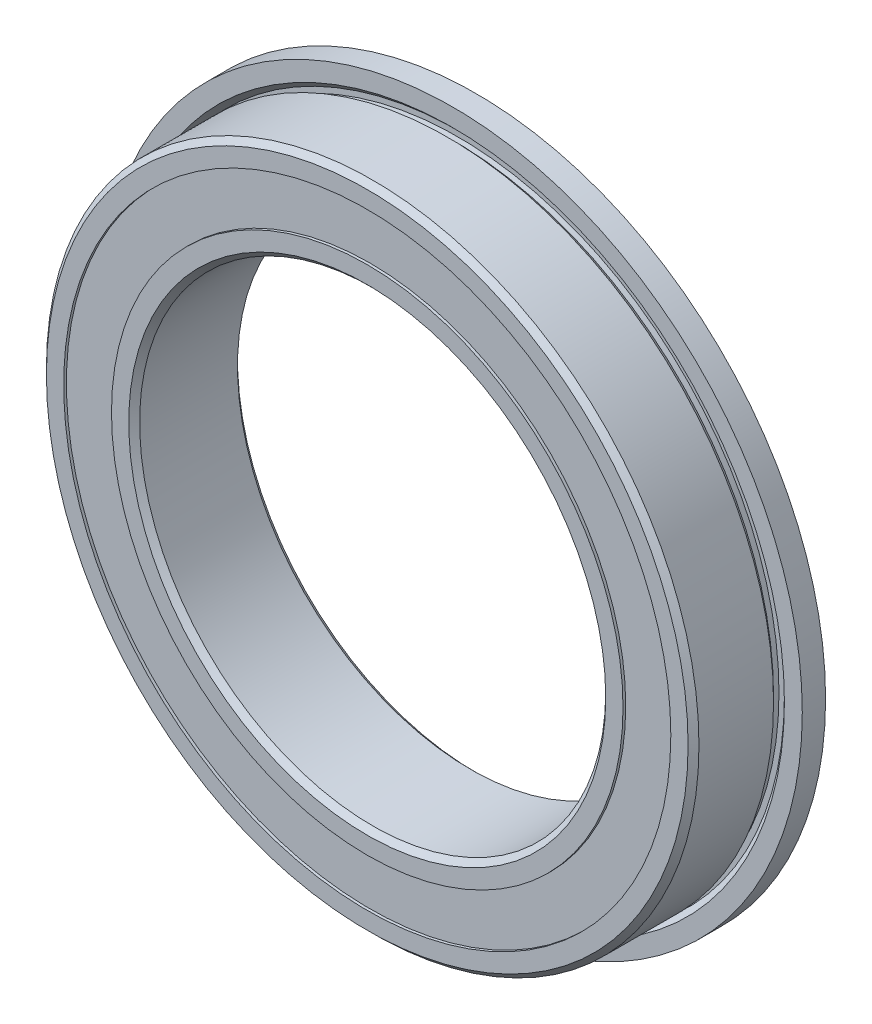
ISO-10303-21;
HEADER;
FILE_DESCRIPTION(('STEP AP214'),'2;1');
FILE_NAME('part.step','',(''),(''),'','','');
FILE_SCHEMA(('AUTOMOTIVE_DESIGN { 1 0 10303 214 1 1 1 1 }'));
ENDSEC;
DATA;
#1=APPLICATION_CONTEXT('core data for automotive mechanical design processes');
#2=APPLICATION_PROTOCOL_DEFINITION('international standard','automotive_design',2000,#1);
#3=PRODUCT_CONTEXT('',#1,'mechanical');
#4=PRODUCT('Part','Part','',(#3));
#5=PRODUCT_RELATED_PRODUCT_CATEGORY('part','',(#4));
#6=PRODUCT_DEFINITION_FORMATION('','',#4);
#7=PRODUCT_DEFINITION_CONTEXT('part definition',#1,'design');
#8=PRODUCT_DEFINITION('design','',#6,#7);
#9=PRODUCT_DEFINITION_SHAPE('','',#8);
#10=(LENGTH_UNIT() NAMED_UNIT(*) SI_UNIT(.MILLI.,.METRE.));
#11=(NAMED_UNIT(*) PLANE_ANGLE_UNIT() SI_UNIT($,.RADIAN.));
#12=(NAMED_UNIT(*) SI_UNIT($,.STERADIAN.) SOLID_ANGLE_UNIT());
#13=UNCERTAINTY_MEASURE_WITH_UNIT(LENGTH_MEASURE(1.E-05),#10,'distance_accuracy_value','');
#14=(GEOMETRIC_REPRESENTATION_CONTEXT(3) GLOBAL_UNCERTAINTY_ASSIGNED_CONTEXT((#13)) GLOBAL_UNIT_ASSIGNED_CONTEXT((#10,
#11,#12)) REPRESENTATION_CONTEXT('',''));
#15=CARTESIAN_POINT('',(0.,0.,0.));
#16=DIRECTION('',(0.,0.,1.));
#17=DIRECTION('',(1.,0.,0.));
#18=AXIS2_PLACEMENT_3D('',#15,#16,#17);
#19=CARTESIAN_POINT('',(0.,19.5384615384615,-3.32499999999999));
#20=DIRECTION('',(0.,0.,1.));
#21=DIRECTION('',(1.,0.,0.));
#22=AXIS2_PLACEMENT_3D('',#19,#20,#21);
#23=PLANE('',#22);
#24=CARTESIAN_POINT('',(0.,0.,-3.32499999999999));
#25=DIRECTION('',(0.,0.,1.));
#26=DIRECTION('',(1.,0.,0.));
#27=AXIS2_PLACEMENT_3D('',#24,#25,#26);
#28=CIRCLE('',#27,19.5384615384615);
#29=CARTESIAN_POINT('',(19.5384615384615,0.,-3.32499999999999));
#30=VERTEX_POINT('',#29);
#31=EDGE_CURVE('E68',#30,#30,#28,.T.);
#32=ORIENTED_EDGE('',*,*,#31,.F.);
#33=EDGE_LOOP('',(#32));
#34=FACE_BOUND('',#33,.T.);
#35=CARTESIAN_POINT('',(0.,0.,-3.32499999999999));
#36=DIRECTION('',(0.,0.,1.));
#37=DIRECTION('',(1.,0.,0.));
#38=AXIS2_PLACEMENT_3D('',#35,#36,#37);
#39=CIRCLE('',#38,16.4615384615385);
#40=CARTESIAN_POINT('',(16.4615384615385,0.,-3.32499999999999));
#41=VERTEX_POINT('',#40);
#42=EDGE_CURVE('E11',#41,#41,#39,.T.);
#43=ORIENTED_EDGE('',*,*,#42,.T.);
#44=EDGE_LOOP('',(#43));
#45=FACE_BOUND('',#44,.T.);
#46=ADVANCED_FACE('F49',(#34,#45),#23,.F.);
#47=CARTESIAN_POINT('',(0.,0.,3.5));
#48=DIRECTION('',(0.,0.,1.));
#49=DIRECTION('',(1.,0.,0.));
#50=AXIS2_PLACEMENT_3D('',#47,#48,#49);
#51=CYLINDRICAL_SURFACE('',#50,16.4615384615385);
#52=ORIENTED_EDGE('',*,*,#42,.F.);
#53=EDGE_LOOP('',(#52));
#54=FACE_BOUND('',#53,.T.);
#55=CARTESIAN_POINT('',(0.,0.,-2.18783385835058));
#56=DIRECTION('',(0.,0.,1.));
#57=DIRECTION('',(1.,0.,0.));
#58=AXIS2_PLACEMENT_3D('',#55,#56,#57);
#59=CIRCLE('',#58,16.4615384615385);
#60=CARTESIAN_POINT('',(16.4615384615385,0.,-2.18783385835058));
#61=VERTEX_POINT('',#60);
#62=EDGE_CURVE('E60',#61,#61,#59,.T.);
#63=ORIENTED_EDGE('',*,*,#62,.T.);
#64=EDGE_LOOP('',(#63));
#65=FACE_BOUND('',#64,.T.);
#66=ADVANCED_FACE('F78',(#54,#65),#51,.F.);
#67=CARTESIAN_POINT('',(0.,19.5384615384615,-2.18783385835058));
#68=DIRECTION('',(0.,0.,-1.));
#69=DIRECTION('',(-1.,0.,0.));
#70=AXIS2_PLACEMENT_3D('',#67,#68,#69);
#71=PLANE('',#70);
#72=ORIENTED_EDGE('',*,*,#62,.F.);
#73=EDGE_LOOP('',(#72));
#74=FACE_BOUND('',#73,.T.);
#75=CARTESIAN_POINT('',(0.,0.,-2.18783385835058));
#76=DIRECTION('',(0.,0.,1.));
#77=DIRECTION('',(1.,0.,0.));
#78=AXIS2_PLACEMENT_3D('',#75,#76,#77);
#79=CIRCLE('',#78,19.5384615384615);
#80=CARTESIAN_POINT('',(19.5384615384615,0.,-2.18783385835058));
#81=VERTEX_POINT('',#80);
#82=EDGE_CURVE('E64',#81,#81,#79,.T.);
#83=ORIENTED_EDGE('',*,*,#82,.T.);
#84=EDGE_LOOP('',(#83));
#85=FACE_BOUND('',#84,.T.);
#86=ADVANCED_FACE('F81',(#74,#85),#71,.F.);
#87=CARTESIAN_POINT('',(0.,0.,3.5));
#88=DIRECTION('',(0.,0.,1.));
#89=DIRECTION('',(1.,0.,0.));
#90=AXIS2_PLACEMENT_3D('',#87,#88,#89);
#91=CYLINDRICAL_SURFACE('',#90,19.5384615384615);
#92=ORIENTED_EDGE('',*,*,#82,.F.);
#93=EDGE_LOOP('',(#92));
#94=FACE_BOUND('',#93,.T.);
#95=ORIENTED_EDGE('',*,*,#31,.T.);
#96=EDGE_LOOP('',(#95));
#97=FACE_BOUND('',#96,.T.);
#98=ADVANCED_FACE('F80',(#94,#97),#91,.T.);
#99=CLOSED_SHELL('',(#46,#66,#86,#98));
#100=MANIFOLD_SOLID_BREP('B2',#99);
#101=CARTESIAN_POINT('',(0.,19.5384615384615,3.32499999999999));
#102=DIRECTION('',(0.,0.,-1.));
#103=DIRECTION('',(-1.,0.,0.));
#104=AXIS2_PLACEMENT_3D('',#101,#102,#103);
#105=PLANE('',#104);
#106=CARTESIAN_POINT('',(0.,0.,3.32499999999999));
#107=DIRECTION('',(0.,0.,1.));
#108=DIRECTION('',(1.,0.,0.));
#109=AXIS2_PLACEMENT_3D('',#106,#107,#108);
#110=CIRCLE('',#109,16.4615384615385);
#111=CARTESIAN_POINT('',(16.4615384615385,0.,3.32499999999999));
#112=VERTEX_POINT('',#111);
#113=EDGE_CURVE('E47',#112,#112,#110,.T.);
#114=ORIENTED_EDGE('',*,*,#113,.F.);
#115=EDGE_LOOP('',(#114));
#116=FACE_BOUND('',#115,.T.);
#117=CARTESIAN_POINT('',(0.,0.,3.32499999999999));
#118=DIRECTION('',(0.,0.,1.));
#119=DIRECTION('',(1.,0.,0.));
#120=AXIS2_PLACEMENT_3D('',#117,#118,#119);
#121=CIRCLE('',#120,19.5384615384615);
#122=CARTESIAN_POINT('',(19.5384615384615,0.,3.32499999999999));
#123=VERTEX_POINT('',#122);
#124=EDGE_CURVE('E143',#123,#123,#121,.T.);
#125=ORIENTED_EDGE('',*,*,#124,.T.);
#126=EDGE_LOOP('',(#125));
#127=FACE_BOUND('',#126,.T.);
#128=ADVANCED_FACE('F127',(#116,#127),#105,.F.);
#129=CARTESIAN_POINT('',(0.,0.,3.5));
#130=DIRECTION('',(0.,0.,1.));
#131=DIRECTION('',(1.,0.,0.));
#132=AXIS2_PLACEMENT_3D('',#129,#130,#131);
#133=CYLINDRICAL_SURFACE('',#132,16.4615384615385);
#134=CARTESIAN_POINT('',(0.,0.,2.18783385835058));
#135=DIRECTION('',(0.,0.,1.));
#136=DIRECTION('',(1.,0.,0.));
#137=AXIS2_PLACEMENT_3D('',#134,#135,#136);
#138=CIRCLE('',#137,16.4615384615385);
#139=CARTESIAN_POINT('',(16.4615384615385,0.,2.18783385835058));
#140=VERTEX_POINT('',#139);
#141=EDGE_CURVE('E135',#140,#140,#138,.T.);
#142=ORIENTED_EDGE('',*,*,#141,.F.);
#143=EDGE_LOOP('',(#142));
#144=FACE_BOUND('',#143,.T.);
#145=ORIENTED_EDGE('',*,*,#113,.T.);
#146=EDGE_LOOP('',(#145));
#147=FACE_BOUND('',#146,.T.);
#148=ADVANCED_FACE('F162',(#144,#147),#133,.F.);
#149=CARTESIAN_POINT('',(0.,19.5384615384615,2.18783385835058));
#150=DIRECTION('',(0.,0.,1.));
#151=DIRECTION('',(1.,0.,0.));
#152=AXIS2_PLACEMENT_3D('',#149,#150,#151);
#153=PLANE('',#152);
#154=CARTESIAN_POINT('',(0.,0.,2.18783385835058));
#155=DIRECTION('',(0.,0.,1.));
#156=DIRECTION('',(1.,0.,0.));
#157=AXIS2_PLACEMENT_3D('',#154,#155,#156);
#158=CIRCLE('',#157,19.5384615384615);
#159=CARTESIAN_POINT('',(19.5384615384615,0.,2.18783385835058));
#160=VERTEX_POINT('',#159);
#161=EDGE_CURVE('E140',#160,#160,#158,.T.);
#162=ORIENTED_EDGE('',*,*,#161,.F.);
#163=EDGE_LOOP('',(#162));
#164=FACE_BOUND('',#163,.T.);
#165=ORIENTED_EDGE('',*,*,#141,.T.);
#166=EDGE_LOOP('',(#165));
#167=FACE_BOUND('',#166,.T.);
#168=ADVANCED_FACE('F160',(#164,#167),#153,.F.);
#169=CARTESIAN_POINT('',(0.,0.,3.5));
#170=DIRECTION('',(0.,0.,1.));
#171=DIRECTION('',(1.,0.,0.));
#172=AXIS2_PLACEMENT_3D('',#169,#170,#171);
#173=CYLINDRICAL_SURFACE('',#172,19.5384615384615);
#174=ORIENTED_EDGE('',*,*,#124,.F.);
#175=EDGE_LOOP('',(#174));
#176=FACE_BOUND('',#175,.T.);
#177=ORIENTED_EDGE('',*,*,#161,.T.);
#178=EDGE_LOOP('',(#177));
#179=FACE_BOUND('',#178,.T.);
#180=ADVANCED_FACE('F153',(#176,#179),#173,.T.);
#181=CLOSED_SHELL('',(#128,#148,#168,#180));
#182=MANIFOLD_SOLID_BREP('B6',#181);
#183=CARTESIAN_POINT('',(-6.50234999136853,16.7845001292785,0.));
#184=DIRECTION('',(0.,0.,1.));
#185=DIRECTION('',(-0.361241666187141,0.932472229404361,0.));
#186=AXIS2_PLACEMENT_3D('',#183,#184,#185);
#187=SPHERICAL_SURFACE('',#186,2.18783385835058);
#188=CARTESIAN_POINT('',(-6.50234999136853,16.7845001292785,2.18783385835058));
#189=VERTEX_POINT('',#188);
#190=VERTEX_LOOP('',#189);
#191=FACE_BOUND('',#190,.T.);
#192=ADVANCED_FACE('F204',(#191),#187,.T.);
#193=CLOSED_SHELL('',(#192));
#194=MANIFOLD_SOLID_BREP('B42',#193);
#195=CARTESIAN_POINT('',(-12.1265215856379,13.302160509972,0.));
#196=DIRECTION('',(0.,0.,1.));
#197=DIRECTION('',(-0.673695643646548,0.739008917220668,0.));
#198=AXIS2_PLACEMENT_3D('',#195,#196,#197);
#199=SPHERICAL_SURFACE('',#198,2.18783385835058);
#200=CARTESIAN_POINT('',(-12.1265215856379,13.302160509972,2.18783385835058));
#201=VERTEX_POINT('',#200);
#202=VERTEX_LOOP('',#201);
#203=FACE_BOUND('',#202,.T.);
#204=ADVANCED_FACE('F221',(#203),#199,.T.);
#205=CLOSED_SHELL('',(#204));
#206=MANIFOLD_SOLID_BREP('B125',#205);
#207=CARTESIAN_POINT('',(-16.112939244391,8.02329040397788,0.));
#208=DIRECTION('',(0.,0.,1.));
#209=DIRECTION('',(-0.895163291355057,0.445738355776549,0.));
#210=AXIS2_PLACEMENT_3D('',#207,#208,#209);
#211=SPHERICAL_SURFACE('',#210,2.18783385835058);
#212=CARTESIAN_POINT('',(-16.112939244391,8.02329040397788,2.18783385835058));
#213=VERTEX_POINT('',#212);
#214=VERTEX_LOOP('',#213);
#215=FACE_BOUND('',#214,.T.);
#216=ADVANCED_FACE('F245',(#215),#211,.T.);
#217=CLOSED_SHELL('',(#216));
#218=MANIFOLD_SOLID_BREP('B200',#217);
#219=CARTESIAN_POINT('',(-17.9232151733106,1.66083047033964,0.));
#220=DIRECTION('',(0.,0.,1.));
#221=DIRECTION('',(-0.995734176295033,0.092268359463313,0.));
#222=AXIS2_PLACEMENT_3D('',#219,#220,#221);
#223=SPHERICAL_SURFACE('',#222,2.18783385835058);
#224=CARTESIAN_POINT('',(-17.9232151733106,1.66083047033964,2.18783385835058));
#225=VERTEX_POINT('',#224);
#226=VERTEX_LOOP('',#225);
#227=FACE_BOUND('',#226,.T.);
#228=ADVANCED_FACE('F265',(#227),#223,.T.);
#229=CLOSED_SHELL('',(#228));
#230=MANIFOLD_SOLID_BREP('B216',#229);
#231=CARTESIAN_POINT('',(-17.3128615771108,-4.92593382129731,0.));
#232=DIRECTION('',(0.,0.,1.));
#233=DIRECTION('',(-0.961825643172822,-0.273662990072073,0.));
#234=AXIS2_PLACEMENT_3D('',#231,#232,#233);
#235=SPHERICAL_SURFACE('',#234,2.18783385835058);
#236=CARTESIAN_POINT('',(-17.3128615771108,-4.92593382129731,2.18783385835058));
#237=VERTEX_POINT('',#236);
#238=VERTEX_LOOP('',#237);
#239=FACE_BOUND('',#238,.T.);
#240=ADVANCED_FACE('F283',(#239),#235,.T.);
#241=CLOSED_SHELL('',(#240));
#242=MANIFOLD_SOLID_BREP('B238',#241);
#243=CARTESIAN_POINT('',(-14.3643100910444,-10.8474234548265,0.));
#244=DIRECTION('',(0.,0.,1.));
#245=DIRECTION('',(-0.798017227280245,-0.602634636379249,0.));
#246=AXIS2_PLACEMENT_3D('',#243,#244,#245);
#247=SPHERICAL_SURFACE('',#246,2.18783385835058);
#248=CARTESIAN_POINT('',(-14.3643100910444,-10.8474234548265,2.18783385835058));
#249=VERTEX_POINT('',#248);
#250=VERTEX_LOOP('',#249);
#251=FACE_BOUND('',#250,.T.);
#252=ADVANCED_FACE('F304',(#251),#247,.T.);
#253=CLOSED_SHELL('',(#252));
#254=MANIFOLD_SOLID_BREP('B256',#253);
#255=CARTESIAN_POINT('',(-9.47577893179253,-15.303908443133,0.));
#256=DIRECTION('',(0.,0.,1.));
#257=DIRECTION('',(-0.526432162877363,-0.85021713572961,0.));
#258=AXIS2_PLACEMENT_3D('',#255,#256,#257);
#259=SPHERICAL_SURFACE('',#258,2.18783385835058);
#260=CARTESIAN_POINT('',(-9.47577893179253,-15.303908443133,2.18783385835058));
#261=VERTEX_POINT('',#260);
#262=VERTEX_LOOP('',#261);
#263=FACE_BOUND('',#262,.T.);
#264=ADVANCED_FACE('F329',(#263),#259,.T.);
#265=CLOSED_SHELL('',(#264));
#266=MANIFOLD_SOLID_BREP('B278',#265);
#267=CARTESIAN_POINT('',(-3.3074913206984,-17.6935157943102,0.));
#268=DIRECTION('',(0.,0.,1.));
#269=DIRECTION('',(-0.183749517816578,-0.9829730996839,0.));
#270=AXIS2_PLACEMENT_3D('',#267,#268,#269);
#271=SPHERICAL_SURFACE('',#270,2.18783385835058);
#272=CARTESIAN_POINT('',(-3.3074913206984,-17.6935157943102,2.18783385835058));
#273=VERTEX_POINT('',#272);
#274=VERTEX_LOOP('',#273);
#275=FACE_BOUND('',#274,.T.);
#276=ADVANCED_FACE('F346',(#275),#271,.T.);
#277=CLOSED_SHELL('',(#276));
#278=MANIFOLD_SOLID_BREP('B301',#277);
#279=CARTESIAN_POINT('',(3.30749132069815,-17.6935157943103,0.));
#280=DIRECTION('',(0.,0.,1.));
#281=DIRECTION('',(0.183749517816564,-0.982973099683903,0.));
#282=AXIS2_PLACEMENT_3D('',#279,#280,#281);
#283=SPHERICAL_SURFACE('',#282,2.18783385835058);
#284=CARTESIAN_POINT('',(3.30749132069815,-17.6935157943103,2.18783385835058));
#285=VERTEX_POINT('',#284);
#286=VERTEX_LOOP('',#285);
#287=FACE_BOUND('',#286,.T.);
#288=ADVANCED_FACE('F368',(#287),#283,.T.);
#289=CLOSED_SHELL('',(#288));
#290=MANIFOLD_SOLID_BREP('B325',#289);
#291=CARTESIAN_POINT('',(9.47577893179231,-15.3039084431331,0.));
#292=DIRECTION('',(0.,0.,1.));
#293=DIRECTION('',(0.526432162877351,-0.850217135729617,0.));
#294=AXIS2_PLACEMENT_3D('',#291,#292,#293);
#295=SPHERICAL_SURFACE('',#294,2.18783385835058);
#296=CARTESIAN_POINT('',(9.47577893179231,-15.3039084431331,2.18783385835058));
#297=VERTEX_POINT('',#296);
#298=VERTEX_LOOP('',#297);
#299=FACE_BOUND('',#298,.T.);
#300=ADVANCED_FACE('F386',(#299),#295,.T.);
#301=CLOSED_SHELL('',(#300));
#302=MANIFOLD_SOLID_BREP('B344',#301);
#303=CARTESIAN_POINT('',(14.3643100910443,-10.8474234548267,0.));
#304=DIRECTION('',(0.,0.,1.));
#305=DIRECTION('',(0.798017227280236,-0.602634636379261,0.));
#306=AXIS2_PLACEMENT_3D('',#303,#304,#305);
#307=SPHERICAL_SURFACE('',#306,2.18783385835058);
#308=CARTESIAN_POINT('',(14.3643100910443,-10.8474234548267,2.18783385835058));
#309=VERTEX_POINT('',#308);
#310=VERTEX_LOOP('',#309);
#311=FACE_BOUND('',#310,.T.);
#312=ADVANCED_FACE('F408',(#311),#307,.T.);
#313=CLOSED_SHELL('',(#312));
#314=MANIFOLD_SOLID_BREP('B364',#313);
#315=CARTESIAN_POINT('',(17.3128615771107,-4.92593382129756,0.));
#316=DIRECTION('',(0.,0.,1.));
#317=DIRECTION('',(0.961825643172818,-0.273662990072087,0.));
#318=AXIS2_PLACEMENT_3D('',#315,#316,#317);
#319=SPHERICAL_SURFACE('',#318,2.18783385835058);
#320=CARTESIAN_POINT('',(17.3128615771107,-4.92593382129756,2.18783385835058));
#321=VERTEX_POINT('',#320);
#322=VERTEX_LOOP('',#321);
#323=FACE_BOUND('',#322,.T.);
#324=ADVANCED_FACE('F431',(#323),#319,.T.);
#325=CLOSED_SHELL('',(#324));
#326=MANIFOLD_SOLID_BREP('B383',#325);
#327=CARTESIAN_POINT('',(17.9232151733106,1.66083047033938,0.));
#328=DIRECTION('',(0.,0.,1.));
#329=DIRECTION('',(0.995734176295035,0.0922683594632987,0.));
#330=AXIS2_PLACEMENT_3D('',#327,#328,#329);
#331=SPHERICAL_SURFACE('',#330,2.18783385835058);
#332=CARTESIAN_POINT('',(17.9232151733106,1.66083047033938,2.18783385835058));
#333=VERTEX_POINT('',#332);
#334=VERTEX_LOOP('',#333);
#335=FACE_BOUND('',#334,.T.);
#336=ADVANCED_FACE('F455',(#335),#331,.T.);
#337=CLOSED_SHELL('',(#336));
#338=MANIFOLD_SOLID_BREP('B407',#337);
#339=CARTESIAN_POINT('',(16.1129392443911,8.02329040397765,0.));
#340=DIRECTION('',(0.,0.,1.));
#341=DIRECTION('',(0.895163291355063,0.445738355776536,0.));
#342=AXIS2_PLACEMENT_3D('',#339,#340,#341);
#343=SPHERICAL_SURFACE('',#342,2.18783385835058);
#344=CARTESIAN_POINT('',(16.1129392443911,8.02329040397765,2.18783385835058));
#345=VERTEX_POINT('',#344);
#346=VERTEX_LOOP('',#345);
#347=FACE_BOUND('',#346,.T.);
#348=ADVANCED_FACE('F474',(#347),#343,.T.);
#349=CLOSED_SHELL('',(#348));
#350=MANIFOLD_SOLID_BREP('B430',#349);
#351=CARTESIAN_POINT('',(12.1265215856381,13.3021605099718,0.));
#352=DIRECTION('',(0.,0.,1.));
#353=DIRECTION('',(0.673695643646558,0.739008917220658,0.));
#354=AXIS2_PLACEMENT_3D('',#351,#352,#353);
#355=SPHERICAL_SURFACE('',#354,2.18783385835058);
#356=CARTESIAN_POINT('',(12.1265215856381,13.3021605099718,2.18783385835058));
#357=VERTEX_POINT('',#356);
#358=VERTEX_LOOP('',#357);
#359=FACE_BOUND('',#358,.T.);
#360=ADVANCED_FACE('F494',(#359),#355,.T.);
#361=CLOSED_SHELL('',(#360));
#362=MANIFOLD_SOLID_BREP('B449',#361);
#363=CARTESIAN_POINT('',(6.50234999136877,16.7845001292784,0.));
#364=DIRECTION('',(0.,0.,1.));
#365=DIRECTION('',(0.361241666187154,0.932472229404355,0.));
#366=AXIS2_PLACEMENT_3D('',#363,#364,#365);
#367=SPHERICAL_SURFACE('',#366,2.18783385835058);
#368=CARTESIAN_POINT('',(6.50234999136877,16.7845001292784,2.18783385835058));
#369=VERTEX_POINT('',#368);
#370=VERTEX_LOOP('',#369);
#371=FACE_BOUND('',#370,.T.);
#372=ADVANCED_FACE('F513',(#371),#367,.T.);
#373=CLOSED_SHELL('',(#372));
#374=MANIFOLD_SOLID_BREP('B469',#373);
#375=CARTESIAN_POINT('',(0.,18.,0.));
#376=DIRECTION('',(0.,0.,1.));
#377=DIRECTION('',(0.,1.,0.));
#378=AXIS2_PLACEMENT_3D('',#375,#376,#377);
#379=SPHERICAL_SURFACE('',#378,2.18783385835058);
#380=CARTESIAN_POINT('',(0.,18.,2.18783385835058));
#381=VERTEX_POINT('',#380);
#382=VERTEX_LOOP('',#381);
#383=FACE_BOUND('',#382,.T.);
#384=ADVANCED_FACE('F539',(#383),#379,.T.);
#385=CLOSED_SHELL('',(#384));
#386=MANIFOLD_SOLID_BREP('B489',#385);
#387=CARTESIAN_POINT('',(0.,18.7692307692308,0.256410256410257));
#388=DIRECTION('',(0.,0.,-1.));
#389=DIRECTION('',(-1.,0.,0.));
#390=AXIS2_PLACEMENT_3D('',#387,#388,#389);
#391=PLANE('',#390);
#392=CARTESIAN_POINT('',(0.,0.,0.256410256410257));
#393=DIRECTION('',(0.,0.,1.));
#394=DIRECTION('',(1.,0.,0.));
#395=AXIS2_PLACEMENT_3D('',#392,#393,#394);
#396=CIRCLE('',#395,17.2307692307692);
#397=CARTESIAN_POINT('',(17.2307692307692,0.,0.256410256410257));
#398=VERTEX_POINT('',#397);
#399=EDGE_CURVE('E540',#398,#398,#396,.T.);
#400=ORIENTED_EDGE('',*,*,#399,.F.);
#401=EDGE_LOOP('',(#400));
#402=FACE_BOUND('',#401,.T.);
#403=CARTESIAN_POINT('',(0.,0.,0.256410256410257));
#404=DIRECTION('',(0.,0.,1.));
#405=DIRECTION('',(1.,0.,0.));
#406=AXIS2_PLACEMENT_3D('',#403,#404,#405);
#407=CIRCLE('',#406,18.7692307692308);
#408=CARTESIAN_POINT('',(18.7692307692308,0.,0.256410256410257));
#409=VERTEX_POINT('',#408);
#410=EDGE_CURVE('E579',#409,#409,#407,.T.);
#411=ORIENTED_EDGE('',*,*,#410,.T.);
#412=EDGE_LOOP('',(#411));
#413=FACE_BOUND('',#412,.T.);
#414=ADVANCED_FACE('F559',(#402,#413),#391,.F.);
#415=CARTESIAN_POINT('',(0.,0.,3.5));
#416=DIRECTION('',(0.,0.,1.));
#417=DIRECTION('',(1.,0.,0.));
#418=AXIS2_PLACEMENT_3D('',#415,#416,#417);
#419=CYLINDRICAL_SURFACE('',#418,17.2307692307692);
#420=CARTESIAN_POINT('',(0.,0.,-0.256410256410256));
#421=DIRECTION('',(0.,0.,1.));
#422=DIRECTION('',(1.,0.,0.));
#423=AXIS2_PLACEMENT_3D('',#420,#421,#422);
#424=CIRCLE('',#423,17.2307692307692);
#425=CARTESIAN_POINT('',(17.2307692307692,0.,-0.256410256410256));
#426=VERTEX_POINT('',#425);
#427=EDGE_CURVE('E566',#426,#426,#424,.T.);
#428=ORIENTED_EDGE('',*,*,#427,.F.);
#429=EDGE_LOOP('',(#428));
#430=FACE_BOUND('',#429,.T.);
#431=ORIENTED_EDGE('',*,*,#399,.T.);
#432=EDGE_LOOP('',(#431));
#433=FACE_BOUND('',#432,.T.);
#434=ADVANCED_FACE('F591',(#430,#433),#419,.F.);
#435=CARTESIAN_POINT('',(0.,18.7692307692308,-0.256410256410256));
#436=DIRECTION('',(0.,0.,1.));
#437=DIRECTION('',(1.,0.,0.));
#438=AXIS2_PLACEMENT_3D('',#435,#436,#437);
#439=PLANE('',#438);
#440=CARTESIAN_POINT('',(0.,0.,-0.256410256410256));
#441=DIRECTION('',(0.,0.,1.));
#442=DIRECTION('',(1.,0.,0.));
#443=AXIS2_PLACEMENT_3D('',#440,#441,#442);
#444=CIRCLE('',#443,18.7692307692308);
#445=CARTESIAN_POINT('',(18.7692307692308,0.,-0.256410256410256));
#446=VERTEX_POINT('',#445);
#447=EDGE_CURVE('E575',#446,#446,#444,.T.);
#448=ORIENTED_EDGE('',*,*,#447,.F.);
#449=EDGE_LOOP('',(#448));
#450=FACE_BOUND('',#449,.T.);
#451=ORIENTED_EDGE('',*,*,#427,.T.);
#452=EDGE_LOOP('',(#451));
#453=FACE_BOUND('',#452,.T.);
#454=ADVANCED_FACE('F587',(#450,#453),#439,.F.);
#455=CARTESIAN_POINT('',(0.,0.,3.5));
#456=DIRECTION('',(0.,0.,1.));
#457=DIRECTION('',(1.,0.,0.));
#458=AXIS2_PLACEMENT_3D('',#455,#456,#457);
#459=CYLINDRICAL_SURFACE('',#458,18.7692307692308);
#460=ORIENTED_EDGE('',*,*,#410,.F.);
#461=EDGE_LOOP('',(#460));
#462=FACE_BOUND('',#461,.T.);
#463=ORIENTED_EDGE('',*,*,#447,.T.);
#464=EDGE_LOOP('',(#463));
#465=FACE_BOUND('',#464,.T.);
#466=ADVANCED_FACE('F586',(#462,#465),#459,.T.);
#467=CLOSED_SHELL('',(#414,#434,#454,#466));
#468=MANIFOLD_SOLID_BREP('B512',#467);
#469=CARTESIAN_POINT('',(0.,16.4615384615385,3.5));
#470=DIRECTION('',(0.,0.,-1.));
#471=DIRECTION('',(-1.,0.,0.));
#472=AXIS2_PLACEMENT_3D('',#469,#470,#471);
#473=PLANE('',#472);
#474=CARTESIAN_POINT('',(0.,0.,3.5));
#475=DIRECTION('',(0.,0.,1.));
#476=DIRECTION('',(1.,0.,0.));
#477=AXIS2_PLACEMENT_3D('',#474,#475,#476);
#478=CIRCLE('',#477,15.35);
#479=CARTESIAN_POINT('',(15.35,0.,3.5));
#480=VERTEX_POINT('',#479);
#481=EDGE_CURVE('E675',#480,#480,#478,.T.);
#482=ORIENTED_EDGE('',*,*,#481,.F.);
#483=EDGE_LOOP('',(#482));
#484=FACE_BOUND('',#483,.T.);
#485=CARTESIAN_POINT('',(0.,0.,3.5));
#486=DIRECTION('',(0.,0.,1.));
#487=DIRECTION('',(1.,0.,0.));
#488=AXIS2_PLACEMENT_3D('',#485,#486,#487);
#489=CIRCLE('',#488,16.4615384615385);
#490=CARTESIAN_POINT('',(16.4615384615385,0.,3.5));
#491=VERTEX_POINT('',#490);
#492=EDGE_CURVE('E556',#491,#491,#489,.T.);
#493=ORIENTED_EDGE('',*,*,#492,.T.);
#494=EDGE_LOOP('',(#493));
#495=FACE_BOUND('',#494,.T.);
#496=ADVANCED_FACE('F636',(#484,#495),#473,.F.);
#497=CARTESIAN_POINT('',(0.,0.,3.5));
#498=DIRECTION('',(0.,0.,1.));
#499=DIRECTION('',(1.,0.,0.));
#500=AXIS2_PLACEMENT_3D('',#497,#498,#499);
#501=CYLINDRICAL_SURFACE('',#500,16.4615384615385);
#502=ORIENTED_EDGE('',*,*,#492,.F.);
#503=EDGE_LOOP('',(#502));
#504=FACE_BOUND('',#503,.T.);
#505=CARTESIAN_POINT('',(0.,0.,1.55555555555556));
#506=DIRECTION('',(0.,0.,1.));
#507=DIRECTION('',(1.,0.,0.));
#508=AXIS2_PLACEMENT_3D('',#505,#506,#507);
#509=CIRCLE('',#508,16.4615384615385);
#510=CARTESIAN_POINT('',(16.4615384615385,0.,1.55555555555556));
#511=VERTEX_POINT('',#510);
#512=EDGE_CURVE('E644',#511,#511,#509,.T.);
#513=ORIENTED_EDGE('',*,*,#512,.T.);
#514=EDGE_LOOP('',(#513));
#515=FACE_BOUND('',#514,.T.);
#516=ADVANCED_FACE('F682',(#504,#515),#501,.T.);
#517=CARTESIAN_POINT('',(0.,0.,0.));
#518=DIRECTION('',(0.,0.,1.));
#519=DIRECTION('',(1.,0.,0.));
#520=AXIS2_PLACEMENT_3D('',#517,#518,#519);
#521=TOROIDAL_SURFACE('',#520,18.,2.18783385835058);
#522=ORIENTED_EDGE('',*,*,#512,.F.);
#523=EDGE_LOOP('',(#522));
#524=FACE_BOUND('',#523,.T.);
#525=CARTESIAN_POINT('',(0.,0.,-1.55555555555556));
#526=DIRECTION('',(0.,0.,1.));
#527=DIRECTION('',(1.,0.,0.));
#528=AXIS2_PLACEMENT_3D('',#525,#526,#527);
#529=CIRCLE('',#528,16.4615384615385);
#530=CARTESIAN_POINT('',(16.4615384615385,0.,-1.55555555555556));
#531=VERTEX_POINT('',#530);
#532=EDGE_CURVE('E646',#531,#531,#529,.T.);
#533=ORIENTED_EDGE('',*,*,#532,.T.);
#534=EDGE_LOOP('',(#533));
#535=FACE_BOUND('',#534,.T.);
#536=ADVANCED_FACE('F688',(#524,#535),#521,.F.);
#537=CARTESIAN_POINT('',(0.,0.,3.5));
#538=DIRECTION('',(0.,0.,1.));
#539=DIRECTION('',(1.,0.,0.));
#540=AXIS2_PLACEMENT_3D('',#537,#538,#539);
#541=CYLINDRICAL_SURFACE('',#540,16.4615384615385);
#542=ORIENTED_EDGE('',*,*,#532,.F.);
#543=EDGE_LOOP('',(#542));
#544=FACE_BOUND('',#543,.T.);
#545=CARTESIAN_POINT('',(0.,0.,-3.5));
#546=DIRECTION('',(0.,0.,1.));
#547=DIRECTION('',(1.,0.,0.));
#548=AXIS2_PLACEMENT_3D('',#545,#546,#547);
#549=CIRCLE('',#548,16.4615384615385);
#550=CARTESIAN_POINT('',(16.4615384615385,0.,-3.5));
#551=VERTEX_POINT('',#550);
#552=EDGE_CURVE('E652',#551,#551,#549,.T.);
#553=ORIENTED_EDGE('',*,*,#552,.T.);
#554=EDGE_LOOP('',(#553));
#555=FACE_BOUND('',#554,.T.);
#556=ADVANCED_FACE('F691',(#544,#555),#541,.T.);
#557=CARTESIAN_POINT('',(0.,15.35,-3.5));
#558=DIRECTION('',(0.,0.,1.));
#559=DIRECTION('',(1.,0.,0.));
#560=AXIS2_PLACEMENT_3D('',#557,#558,#559);
#561=PLANE('',#560);
#562=ORIENTED_EDGE('',*,*,#552,.F.);
#563=EDGE_LOOP('',(#562));
#564=FACE_BOUND('',#563,.T.);
#565=CARTESIAN_POINT('',(0.,0.,-3.5));
#566=DIRECTION('',(0.,0.,1.));
#567=DIRECTION('',(1.,0.,0.));
#568=AXIS2_PLACEMENT_3D('',#565,#566,#567);
#569=CIRCLE('',#568,15.35);
#570=CARTESIAN_POINT('',(15.35,0.,-3.5));
#571=VERTEX_POINT('',#570);
#572=EDGE_CURVE('E662',#571,#571,#569,.T.);
#573=ORIENTED_EDGE('',*,*,#572,.T.);
#574=EDGE_LOOP('',(#573));
#575=FACE_BOUND('',#574,.T.);
#576=ADVANCED_FACE('F700',(#564,#575),#561,.F.);
#577=CARTESIAN_POINT('',(0.,0.,-3.14999999999998));
#578=DIRECTION('',(0.,0.,-1.));
#579=DIRECTION('',(-1.,0.,0.));
#580=AXIS2_PLACEMENT_3D('',#577,#578,#579);
#581=CONICAL_SURFACE('',#580,15.,0.785398163397443);
#582=ORIENTED_EDGE('',*,*,#572,.F.);
#583=EDGE_LOOP('',(#582));
#584=FACE_BOUND('',#583,.T.);
#585=CARTESIAN_POINT('',(0.,0.,-3.14999999999998));
#586=DIRECTION('',(0.,0.,1.));
#587=DIRECTION('',(1.,0.,0.));
#588=AXIS2_PLACEMENT_3D('',#585,#586,#587);
#589=CIRCLE('',#588,15.);
#590=CARTESIAN_POINT('',(15.,0.,-3.14999999999998));
#591=VERTEX_POINT('',#590);
#592=EDGE_CURVE('E663',#591,#591,#589,.T.);
#593=ORIENTED_EDGE('',*,*,#592,.T.);
#594=EDGE_LOOP('',(#593));
#595=FACE_BOUND('',#594,.T.);
#596=ADVANCED_FACE('F701',(#584,#595),#581,.F.);
#597=CARTESIAN_POINT('',(0.,0.,3.5));
#598=DIRECTION('',(0.,0.,1.));
#599=DIRECTION('',(1.,0.,0.));
#600=AXIS2_PLACEMENT_3D('',#597,#598,#599);
#601=CYLINDRICAL_SURFACE('',#600,15.);
#602=ORIENTED_EDGE('',*,*,#592,.F.);
#603=EDGE_LOOP('',(#602));
#604=FACE_BOUND('',#603,.T.);
#605=CARTESIAN_POINT('',(0.,0.,3.14999999999998));
#606=DIRECTION('',(0.,0.,1.));
#607=DIRECTION('',(1.,0.,0.));
#608=AXIS2_PLACEMENT_3D('',#605,#606,#607);
#609=CIRCLE('',#608,15.);
#610=CARTESIAN_POINT('',(15.,0.,3.14999999999998));
#611=VERTEX_POINT('',#610);
#612=EDGE_CURVE('E666',#611,#611,#609,.T.);
#613=ORIENTED_EDGE('',*,*,#612,.T.);
#614=EDGE_LOOP('',(#613));
#615=FACE_BOUND('',#614,.T.);
#616=ADVANCED_FACE('F704',(#604,#615),#601,.F.);
#617=CARTESIAN_POINT('',(0.,0.,3.5));
#618=DIRECTION('',(0.,0.,1.));
#619=DIRECTION('',(1.,0.,0.));
#620=AXIS2_PLACEMENT_3D('',#617,#618,#619);
#621=CONICAL_SURFACE('',#620,15.35,0.78539816339745);
#622=ORIENTED_EDGE('',*,*,#612,.F.);
#623=EDGE_LOOP('',(#622));
#624=FACE_BOUND('',#623,.T.);
#625=ORIENTED_EDGE('',*,*,#481,.T.);
#626=EDGE_LOOP('',(#625));
#627=FACE_BOUND('',#626,.T.);
#628=ADVANCED_FACE('F678',(#624,#627),#621,.F.);
#629=CLOSED_SHELL('',(#496,#516,#536,#556,#576,#596,#616,#628));
#630=MANIFOLD_SOLID_BREP('B535',#629);
#631=CARTESIAN_POINT('',(0.,0.,3.5));
#632=DIRECTION('',(0.,0.,1.));
#633=DIRECTION('',(1.,0.,0.));
#634=AXIS2_PLACEMENT_3D('',#631,#632,#633);
#635=CYLINDRICAL_SURFACE('',#634,22.5);
#636=CARTESIAN_POINT('',(0.,0.,-1.99999999999991));
#637=DIRECTION('',(0.,0.,1.));
#638=DIRECTION('',(1.,0.,0.));
#639=AXIS2_PLACEMENT_3D('',#636,#637,#638);
#640=CIRCLE('',#639,22.5);
#641=CARTESIAN_POINT('',(22.5,0.,-1.99999999999991));
#642=VERTEX_POINT('',#641);
#643=EDGE_CURVE('E784',#642,#642,#640,.T.);
#644=ORIENTED_EDGE('',*,*,#643,.F.);
#645=EDGE_LOOP('',(#644));
#646=FACE_BOUND('',#645,.T.);
#647=CARTESIAN_POINT('',(0.,0.,-3.49999999999999));
#648=DIRECTION('',(0.,0.,1.));
#649=DIRECTION('',(1.,0.,0.));
#650=AXIS2_PLACEMENT_3D('',#647,#648,#649);
#651=CIRCLE('',#650,22.5);
#652=CARTESIAN_POINT('',(22.5,0.,-3.49999999999999));
#653=VERTEX_POINT('',#652);
#654=EDGE_CURVE('E634',#653,#653,#651,.T.);
#655=ORIENTED_EDGE('',*,*,#654,.T.);
#656=EDGE_LOOP('',(#655));
#657=FACE_BOUND('',#656,.T.);
#658=ADVANCED_FACE('F771',(#646,#657),#635,.T.);
#659=CARTESIAN_POINT('',(0.,22.5,-1.9999999999999));
#660=DIRECTION('',(0.,0.,-1.));
#661=DIRECTION('',(-1.,0.,0.));
#662=AXIS2_PLACEMENT_3D('',#659,#660,#661);
#663=PLANE('',#662);
#664=CARTESIAN_POINT('',(0.,0.,-1.9999999999999));
#665=DIRECTION('',(0.,0.,1.));
#666=DIRECTION('',(1.,0.,0.));
#667=AXIS2_PLACEMENT_3D('',#664,#665,#666);
#668=CIRCLE('',#667,21.35);
#669=CARTESIAN_POINT('',(21.35,0.,-1.9999999999999));
#670=VERTEX_POINT('',#669);
#671=EDGE_CURVE('E789',#670,#670,#668,.T.);
#672=ORIENTED_EDGE('',*,*,#671,.F.);
#673=EDGE_LOOP('',(#672));
#674=FACE_BOUND('',#673,.T.);
#675=ORIENTED_EDGE('',*,*,#643,.T.);
#676=EDGE_LOOP('',(#675));
#677=FACE_BOUND('',#676,.T.);
#678=ADVANCED_FACE('F896',(#674,#677),#663,.F.);
#679=CARTESIAN_POINT('',(0.,0.,-1.9999999999999));
#680=DIRECTION('',(0.,0.,1.));
#681=DIRECTION('',(1.,0.,0.));
#682=AXIS2_PLACEMENT_3D('',#679,#680,#681);
#683=CONICAL_SURFACE('',#682,21.35,0.785398163397452);
#684=CARTESIAN_POINT('',(0.,0.,-2.34999999999994));
#685=DIRECTION('',(0.,0.,1.));
#686=DIRECTION('',(1.,0.,0.));
#687=AXIS2_PLACEMENT_3D('',#684,#685,#686);
#688=CIRCLE('',#687,21.);
#689=CARTESIAN_POINT('',(21.,0.,-2.34999999999994));
#690=VERTEX_POINT('',#689);
#691=EDGE_CURVE('E791',#690,#690,#688,.T.);
#692=ORIENTED_EDGE('',*,*,#691,.F.);
#693=EDGE_LOOP('',(#692));
#694=FACE_BOUND('',#693,.T.);
#695=ORIENTED_EDGE('',*,*,#671,.T.);
#696=EDGE_LOOP('',(#695));
#697=FACE_BOUND('',#696,.T.);
#698=ADVANCED_FACE('F889',(#694,#697),#683,.F.);
#699=CARTESIAN_POINT('',(0.,21.,-2.34999999999994));
#700=DIRECTION('',(0.,0.,-1.));
#701=DIRECTION('',(-1.,0.,0.));
#702=AXIS2_PLACEMENT_3D('',#699,#700,#701);
#703=PLANE('',#702);
#704=CARTESIAN_POINT('',(0.,0.,-2.34999999999994));
#705=DIRECTION('',(0.,0.,1.));
#706=DIRECTION('',(1.,0.,0.));
#707=AXIS2_PLACEMENT_3D('',#704,#705,#706);
#708=CIRCLE('',#707,20.65);
#709=CARTESIAN_POINT('',(20.65,0.,-2.34999999999994));
#710=VERTEX_POINT('',#709);
#711=EDGE_CURVE('E796',#710,#710,#708,.T.);
#712=ORIENTED_EDGE('',*,*,#711,.F.);
#713=EDGE_LOOP('',(#712));
#714=FACE_BOUND('',#713,.T.);
#715=ORIENTED_EDGE('',*,*,#691,.T.);
#716=EDGE_LOOP('',(#715));
#717=FACE_BOUND('',#716,.T.);
#718=ADVANCED_FACE('F884',(#714,#717),#703,.F.);
#719=CARTESIAN_POINT('',(0.,0.,3.5));
#720=DIRECTION('',(0.,0.,1.));
#721=DIRECTION('',(1.,0.,0.));
#722=AXIS2_PLACEMENT_3D('',#719,#720,#721);
#723=CYLINDRICAL_SURFACE('',#722,20.65);
#724=CARTESIAN_POINT('',(0.,0.,-1.99999999999991));
#725=DIRECTION('',(0.,0.,1.));
#726=DIRECTION('',(1.,0.,0.));
#727=AXIS2_PLACEMENT_3D('',#724,#725,#726);
#728=CIRCLE('',#727,20.65);
#729=CARTESIAN_POINT('',(20.65,0.,-1.99999999999991));
#730=VERTEX_POINT('',#729);
#731=EDGE_CURVE('E805',#730,#730,#728,.T.);
#732=ORIENTED_EDGE('',*,*,#731,.F.);
#733=EDGE_LOOP('',(#732));
#734=FACE_BOUND('',#733,.T.);
#735=ORIENTED_EDGE('',*,*,#711,.T.);
#736=EDGE_LOOP('',(#735));
#737=FACE_BOUND('',#736,.T.);
#738=ADVANCED_FACE('F876',(#734,#737),#723,.T.);
#739=CARTESIAN_POINT('',(0.,0.,-1.99999999999991));
#740=DIRECTION('',(0.,0.,1.));
#741=DIRECTION('',(1.,0.,0.));
#742=AXIS2_PLACEMENT_3D('',#739,#740,#741);
#743=CONICAL_SURFACE('',#742,20.65,0.785398163397458);
#744=CARTESIAN_POINT('',(0.,0.,-1.64999999999987));
#745=DIRECTION('',(0.,0.,1.));
#746=DIRECTION('',(1.,0.,0.));
#747=AXIS2_PLACEMENT_3D('',#744,#745,#746);
#748=CIRCLE('',#747,21.);
#749=CARTESIAN_POINT('',(21.,0.,-1.64999999999987));
#750=VERTEX_POINT('',#749);
#751=EDGE_CURVE('E810',#750,#750,#748,.T.);
#752=ORIENTED_EDGE('',*,*,#751,.F.);
#753=EDGE_LOOP('',(#752));
#754=FACE_BOUND('',#753,.T.);
#755=ORIENTED_EDGE('',*,*,#731,.T.);
#756=EDGE_LOOP('',(#755));
#757=FACE_BOUND('',#756,.T.);
#758=ADVANCED_FACE('F875',(#754,#757),#743,.T.);
#759=CARTESIAN_POINT('',(0.,0.,3.5));
#760=DIRECTION('',(0.,0.,1.));
#761=DIRECTION('',(1.,0.,0.));
#762=AXIS2_PLACEMENT_3D('',#759,#760,#761);
#763=CYLINDRICAL_SURFACE('',#762,21.);
#764=CARTESIAN_POINT('',(0.,0.,3.14999999999998));
#765=DIRECTION('',(0.,0.,1.));
#766=DIRECTION('',(1.,0.,0.));
#767=AXIS2_PLACEMENT_3D('',#764,#765,#766);
#768=CIRCLE('',#767,21.);
#769=CARTESIAN_POINT('',(21.,0.,3.14999999999998));
#770=VERTEX_POINT('',#769);
#771=EDGE_CURVE('E813',#770,#770,#768,.T.);
#772=ORIENTED_EDGE('',*,*,#771,.F.);
#773=EDGE_LOOP('',(#772));
#774=FACE_BOUND('',#773,.T.);
#775=ORIENTED_EDGE('',*,*,#751,.T.);
#776=EDGE_LOOP('',(#775));
#777=FACE_BOUND('',#776,.T.);
#778=ADVANCED_FACE('F869',(#774,#777),#763,.T.);
#779=CARTESIAN_POINT('',(0.,0.,3.14999999999998));
#780=DIRECTION('',(0.,0.,-1.));
#781=DIRECTION('',(-1.,0.,0.));
#782=AXIS2_PLACEMENT_3D('',#779,#780,#781);
#783=CONICAL_SURFACE('',#782,21.,0.785398163397445);
#784=CARTESIAN_POINT('',(0.,0.,3.5));
#785=DIRECTION('',(0.,0.,1.));
#786=DIRECTION('',(1.,0.,0.));
#787=AXIS2_PLACEMENT_3D('',#784,#785,#786);
#788=CIRCLE('',#787,20.65);
#789=CARTESIAN_POINT('',(20.65,0.,3.5));
#790=VERTEX_POINT('',#789);
#791=EDGE_CURVE('E814',#790,#790,#788,.T.);
#792=ORIENTED_EDGE('',*,*,#791,.F.);
#793=EDGE_LOOP('',(#792));
#794=FACE_BOUND('',#793,.T.);
#795=ORIENTED_EDGE('',*,*,#771,.T.);
#796=EDGE_LOOP('',(#795));
#797=FACE_BOUND('',#796,.T.);
#798=ADVANCED_FACE('F858',(#794,#797),#783,.T.);
#799=CARTESIAN_POINT('',(0.,20.65,3.5));
#800=DIRECTION('',(0.,0.,-1.));
#801=DIRECTION('',(-1.,0.,0.));
#802=AXIS2_PLACEMENT_3D('',#799,#800,#801);
#803=PLANE('',#802);
#804=CARTESIAN_POINT('',(0.,0.,3.5));
#805=DIRECTION('',(0.,0.,1.));
#806=DIRECTION('',(1.,0.,0.));
#807=AXIS2_PLACEMENT_3D('',#804,#805,#806);
#808=CIRCLE('',#807,19.5384615384615);
#809=CARTESIAN_POINT('',(19.5384615384615,0.,3.5));
#810=VERTEX_POINT('',#809);
#811=EDGE_CURVE('E819',#810,#810,#808,.T.);
#812=ORIENTED_EDGE('',*,*,#811,.F.);
#813=EDGE_LOOP('',(#812));
#814=FACE_BOUND('',#813,.T.);
#815=ORIENTED_EDGE('',*,*,#791,.T.);
#816=EDGE_LOOP('',(#815));
#817=FACE_BOUND('',#816,.T.);
#818=ADVANCED_FACE('F855',(#814,#817),#803,.F.);
#819=CARTESIAN_POINT('',(0.,0.,3.5));
#820=DIRECTION('',(0.,0.,1.));
#821=DIRECTION('',(1.,0.,0.));
#822=AXIS2_PLACEMENT_3D('',#819,#820,#821);
#823=CYLINDRICAL_SURFACE('',#822,19.5384615384615);
#824=CARTESIAN_POINT('',(0.,0.,1.55555555555556));
#825=DIRECTION('',(0.,0.,1.));
#826=DIRECTION('',(1.,0.,0.));
#827=AXIS2_PLACEMENT_3D('',#824,#825,#826);
#828=CIRCLE('',#827,19.5384615384615);
#829=CARTESIAN_POINT('',(19.5384615384615,0.,1.55555555555556));
#830=VERTEX_POINT('',#829);
#831=EDGE_CURVE('E823',#830,#830,#828,.T.);
#832=ORIENTED_EDGE('',*,*,#831,.F.);
#833=EDGE_LOOP('',(#832));
#834=FACE_BOUND('',#833,.T.);
#835=ORIENTED_EDGE('',*,*,#811,.T.);
#836=EDGE_LOOP('',(#835));
#837=FACE_BOUND('',#836,.T.);
#838=ADVANCED_FACE('F850',(#834,#837),#823,.F.);
#839=CARTESIAN_POINT('',(0.,0.,0.));
#840=DIRECTION('',(0.,0.,1.));
#841=DIRECTION('',(1.,0.,0.));
#842=AXIS2_PLACEMENT_3D('',#839,#840,#841);
#843=TOROIDAL_SURFACE('',#842,18.,2.18783385835058);
#844=CARTESIAN_POINT('',(0.,0.,-1.55555555555555));
#845=DIRECTION('',(0.,0.,1.));
#846=DIRECTION('',(1.,0.,0.));
#847=AXIS2_PLACEMENT_3D('',#844,#845,#846);
#848=CIRCLE('',#847,19.5384615384615);
#849=CARTESIAN_POINT('',(19.5384615384615,0.,-1.55555555555555));
#850=VERTEX_POINT('',#849);
#851=EDGE_CURVE('E830',#850,#850,#848,.T.);
#852=ORIENTED_EDGE('',*,*,#851,.F.);
#853=EDGE_LOOP('',(#852));
#854=FACE_BOUND('',#853,.T.);
#855=ORIENTED_EDGE('',*,*,#831,.T.);
#856=EDGE_LOOP('',(#855));
#857=FACE_BOUND('',#856,.T.);
#858=ADVANCED_FACE('F845',(#854,#857),#843,.F.);
#859=CARTESIAN_POINT('',(0.,0.,3.5));
#860=DIRECTION('',(0.,0.,1.));
#861=DIRECTION('',(1.,0.,0.));
#862=AXIS2_PLACEMENT_3D('',#859,#860,#861);
#863=CYLINDRICAL_SURFACE('',#862,19.5384615384615);
#864=CARTESIAN_POINT('',(0.,0.,-3.5));
#865=DIRECTION('',(0.,0.,1.));
#866=DIRECTION('',(1.,0.,0.));
#867=AXIS2_PLACEMENT_3D('',#864,#865,#866);
#868=CIRCLE('',#867,19.5384615384615);
#869=CARTESIAN_POINT('',(19.5384615384615,0.,-3.5));
#870=VERTEX_POINT('',#869);
#871=EDGE_CURVE('E831',#870,#870,#868,.T.);
#872=ORIENTED_EDGE('',*,*,#871,.F.);
#873=EDGE_LOOP('',(#872));
#874=FACE_BOUND('',#873,.T.);
#875=ORIENTED_EDGE('',*,*,#851,.T.);
#876=EDGE_LOOP('',(#875));
#877=FACE_BOUND('',#876,.T.);
#878=ADVANCED_FACE('F836',(#874,#877),#863,.F.);
#879=CARTESIAN_POINT('',(0.,19.5384615384615,-3.5));
#880=DIRECTION('',(0.,0.,1.));
#881=DIRECTION('',(1.,0.,0.));
#882=AXIS2_PLACEMENT_3D('',#879,#880,#881);
#883=PLANE('',#882);
#884=ORIENTED_EDGE('',*,*,#654,.F.);
#885=EDGE_LOOP('',(#884));
#886=FACE_BOUND('',#885,.T.);
#887=ORIENTED_EDGE('',*,*,#871,.T.);
#888=EDGE_LOOP('',(#887));
#889=FACE_BOUND('',#888,.T.);
#890=ADVANCED_FACE('F840',(#886,#889),#883,.F.);
#891=CLOSED_SHELL('',(#658,#678,#698,#718,#738,#758,#778,#798,#818,#838,#858,#878,#890));
#892=MANIFOLD_SOLID_BREP('B551',#891);
#893=ADVANCED_BREP_SHAPE_REPRESENTATION('',(#18,#100,#182,#194,#206,#218,#230,#242,#254,#266,
#278,#290,#302,#314,#326,#338,#350,#362,#374,#386,#468,#630,#892),#14);
#894=SHAPE_DEFINITION_REPRESENTATION(#9,#893);
ENDSEC;
END-ISO-10303-21;
